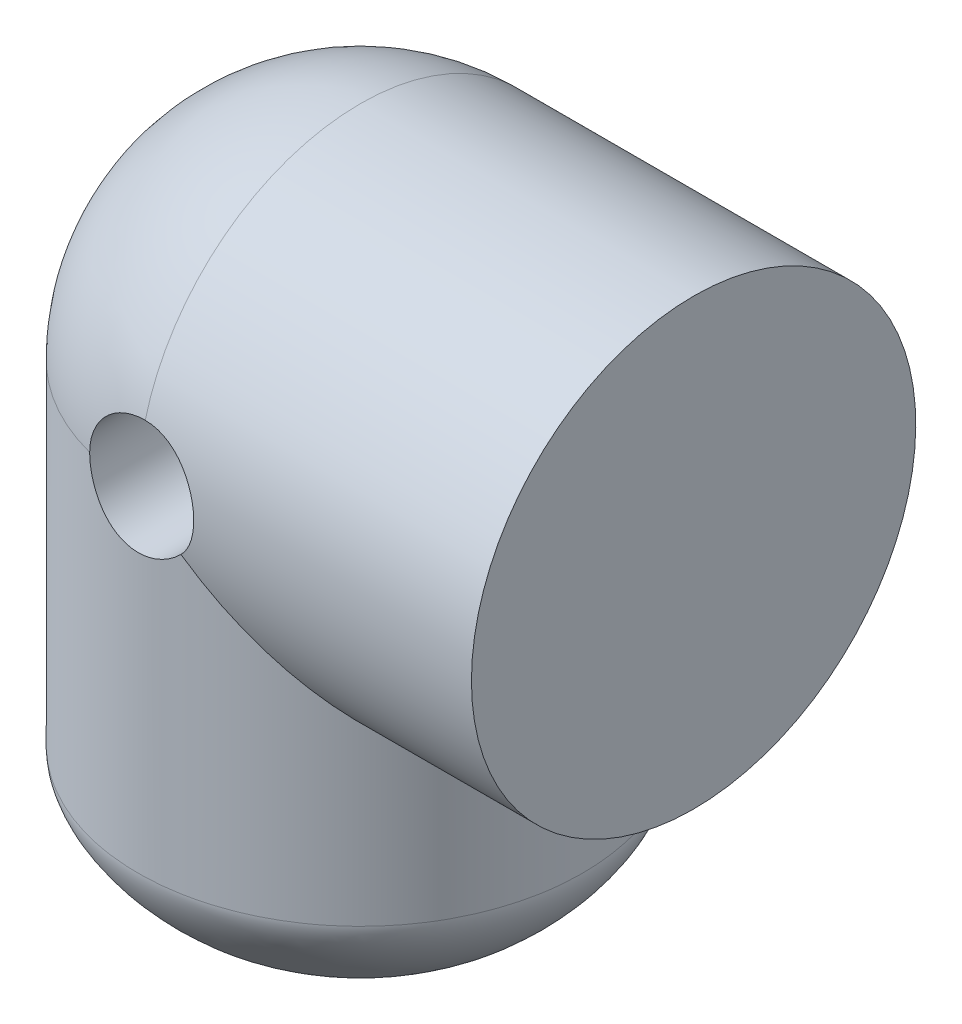
ISO-10303-21;
HEADER;
FILE_DESCRIPTION(('STEP AP214'),'2;1');
FILE_NAME('part.step','',(''),(''),'','','');
FILE_SCHEMA(('AUTOMOTIVE_DESIGN { 1 0 10303 214 1 1 1 1 }'));
ENDSEC;
DATA;
#1=APPLICATION_CONTEXT('core data for automotive mechanical design processes');
#2=APPLICATION_PROTOCOL_DEFINITION('international standard','automotive_design',2000,#1);
#3=PRODUCT_CONTEXT('',#1,'mechanical');
#4=PRODUCT('Part','Part','',(#3));
#5=PRODUCT_RELATED_PRODUCT_CATEGORY('part','',(#4));
#6=PRODUCT_DEFINITION_FORMATION('','',#4);
#7=PRODUCT_DEFINITION_CONTEXT('part definition',#1,'design');
#8=PRODUCT_DEFINITION('design','',#6,#7);
#9=PRODUCT_DEFINITION_SHAPE('','',#8);
#10=(LENGTH_UNIT() NAMED_UNIT(*) SI_UNIT(.MILLI.,.METRE.));
#11=(NAMED_UNIT(*) PLANE_ANGLE_UNIT() SI_UNIT($,.RADIAN.));
#12=(NAMED_UNIT(*) SI_UNIT($,.STERADIAN.) SOLID_ANGLE_UNIT());
#13=UNCERTAINTY_MEASURE_WITH_UNIT(LENGTH_MEASURE(1.E-05),#10,'distance_accuracy_value','');
#14=(GEOMETRIC_REPRESENTATION_CONTEXT(3) GLOBAL_UNCERTAINTY_ASSIGNED_CONTEXT((#13)) GLOBAL_UNIT_ASSIGNED_CONTEXT((#10,
#11,#12)) REPRESENTATION_CONTEXT('',''));
#15=CARTESIAN_POINT('',(0.,0.,0.));
#16=DIRECTION('',(0.,0.,1.));
#17=DIRECTION('',(1.,0.,0.));
#18=AXIS2_PLACEMENT_3D('',#15,#16,#17);
#19=CARTESIAN_POINT('',(0.,140.,0.));
#20=DIRECTION('',(0.,1.,0.));
#21=DIRECTION('',(0.,0.,1.));
#22=AXIS2_PLACEMENT_3D('',#19,#20,#21);
#23=CYLINDRICAL_SURFACE('',#22,20.);
#24=CARTESIAN_POINT('',(0.,150.,-20.));
#25=CARTESIAN_POINT('',(2.61799387362833,150.,-20.));
#26=CARTESIAN_POINT('',(5.23495769121637,150.,-19.4794535316967));
#27=CARTESIAN_POINT('',(10.0723796033872,150.,-17.4757277687548));
#28=CARTESIAN_POINT('',(12.2909344025836,150.,-15.9933368448783));
#29=CARTESIAN_POINT('',(15.9933368448783,150.,-12.2909344025836));
#30=CARTESIAN_POINT('',(17.4757277687555,150.,-10.0723796033854));
#31=CARTESIAN_POINT('',(19.479453531696,150.,-5.23495769121814));
#32=CARTESIAN_POINT('',(20.,150.,-2.61799387362817));
#33=CARTESIAN_POINT('',(20.,150.,2.61799387362817));
#34=CARTESIAN_POINT('',(19.4794535316963,150.,5.23495769121735));
#35=CARTESIAN_POINT('',(17.4757277687552,150.,10.0723796033863));
#36=CARTESIAN_POINT('',(15.9933368448782,150.,12.2909344025837));
#37=CARTESIAN_POINT('',(12.2909344025837,150.,15.9933368448782));
#38=CARTESIAN_POINT('',(10.0723796033861,150.,17.4757277687552));
#39=CARTESIAN_POINT('',(5.23495769121757,150.,19.4794535316962));
#40=CARTESIAN_POINT('',(2.61799387362817,150.,20.));
#41=CARTESIAN_POINT('',(-2.61799387362817,150.,20.));
#42=CARTESIAN_POINT('',(-5.23495769121655,150.,19.4794535316966));
#43=CARTESIAN_POINT('',(-10.072379603387,150.,17.4757277687549));
#44=CARTESIAN_POINT('',(-12.2909344025826,150.,15.9933368448793));
#45=CARTESIAN_POINT('',(-15.9933368448793,150.,12.2909344025826));
#46=CARTESIAN_POINT('',(-17.4757277687549,150.,10.072379603387));
#47=CARTESIAN_POINT('',(-19.4794535316966,150.,5.23495769121668));
#48=CARTESIAN_POINT('',(-20.,150.,2.61799387362814));
#49=CARTESIAN_POINT('',(-20.,150.,-2.61799387362821));
#50=CARTESIAN_POINT('',(-19.4794535316966,150.,-5.23495769121679));
#51=CARTESIAN_POINT('',(-17.475727768755,150.,-10.0723796033868));
#52=CARTESIAN_POINT('',(-15.9933368448774,150.,-12.2909344025845));
#53=CARTESIAN_POINT('',(-12.2909344025846,150.,-15.9933368448773));
#54=CARTESIAN_POINT('',(-10.0723796033859,150.,-17.4757277687553));
#55=CARTESIAN_POINT('',(-5.2349576912178,150.,-19.4794535316961));
#56=CARTESIAN_POINT('',(-2.61799387362834,150.,-20.));
#57=CARTESIAN_POINT('',(0.,150.,-20.));
#58=(BOUNDED_CURVE() B_SPLINE_CURVE(3,(#24,#25,#26,#27,#28,#29,#30,#31,#32,#33,#34,#35,#36,#37,
#38,#39,#40,#41,#42,#43,#44,#45,#46,#47,#48,#49,#50,#51,#52,#53,#54,#55,#56,#57),.UNSPECIFIED.,
.T.,.F.) B_SPLINE_CURVE_WITH_KNOTS((4,2,2,2,2,2,2,2,2,2,2,2,2,2,2,2,4),(0.,0.392699081698724,
0.785398163397448,1.17809724509617,1.5707963267949,1.96349540849362,2.35619449019234,
2.74889357189107,3.14159265358979,3.53429173528852,3.92699081698724,4.31968989868597,
4.71238898038469,5.10508806208341,5.49778714378214,5.89048622548086,6.28318530717959),
.UNSPECIFIED.) CURVE() GEOMETRIC_REPRESENTATION_ITEM() RATIONAL_B_SPLINE_CURVE((1.,1.,1.,1.,1.,
1.,1.,1.,1.,1.,1.,1.,1.,1.,1.,1.,1.,1.,1.,1.,1.,1.,1.,1.,1.,1.,1.,1.,1.,1.,1.,1.,1.,1.)) REPRESENTATION_ITEM(''));
#59=CARTESIAN_POINT('',(0.,150.,-20.));
#60=VERTEX_POINT('',#59);
#61=EDGE_CURVE('E12',#60,#60,#58,.F.);
#62=ORIENTED_EDGE('',*,*,#61,.T.);
#63=EDGE_LOOP('',(#62));
#64=FACE_BOUND('',#63,.T.);
#65=CARTESIAN_POINT('',(0.,180.,0.));
#66=DIRECTION('',(0.,1.,0.));
#67=DIRECTION('',(0.,0.,1.));
#68=AXIS2_PLACEMENT_3D('',#65,#66,#67);
#69=CIRCLE('',#68,20.);
#70=CARTESIAN_POINT('',(-5.,180.,19.3649167310371));
#71=VERTEX_POINT('',#70);
#72=CARTESIAN_POINT('',(-5.,180.,-19.3649167310371));
#73=VERTEX_POINT('',#72);
#74=EDGE_CURVE('E98',#71,#73,#69,.F.);
#75=ORIENTED_EDGE('',*,*,#74,.T.);
#76=CARTESIAN_POINT('',(-5.00000000000001,180.,-19.3649167310371));
#77=CARTESIAN_POINT('',(-5.00001753405856,179.861727049673,-19.3649007839448));
#78=CARTESIAN_POINT('',(-4.99426495949921,179.723459670746,-19.3663971752211));
#79=CARTESIAN_POINT('',(-4.97134855568943,179.447958841176,-19.3722985604214));
#80=CARTESIAN_POINT('',(-4.95418664661753,179.310725220483,-19.3767030649124));
#81=CARTESIAN_POINT('',(-4.90862550526642,179.038536617718,-19.3882932151163));
#82=CARTESIAN_POINT('',(-4.88024853995661,178.903577669662,-19.395473349332));
#83=CARTESIAN_POINT('',(-4.81249819309941,178.636613238401,-19.4123951927565));
#84=CARTESIAN_POINT('',(-4.77312466032893,178.504607795838,-19.4221369371922));
#85=CARTESIAN_POINT('',(-4.68370982441759,178.244502859836,-19.4438929800908));
#86=CARTESIAN_POINT('',(-4.63367187241133,178.116402153813,-19.4559065645286));
#87=CARTESIAN_POINT('',(-4.52328421223624,177.864872268759,-19.4818662950644));
#88=CARTESIAN_POINT('',(-4.46293067960909,177.741444843134,-19.4958131575534));
#89=CARTESIAN_POINT('',(-4.332373738047,177.500128925331,-19.5252403930813));
#90=CARTESIAN_POINT('',(-4.2621716081817,177.382239716536,-19.5407205669073));
#91=CARTESIAN_POINT('',(-4.11237230752994,177.152688078362,-19.5727939032118));
#92=CARTESIAN_POINT('',(-4.03277160234959,177.041028014883,-19.5893874833745));
#93=CARTESIAN_POINT('',(-3.86310059131533,176.822587927837,-19.6235594213257));
#94=CARTESIAN_POINT('',(-3.77285762537103,176.715943988735,-19.6411506158731));
#95=CARTESIAN_POINT('',(-3.58375217632144,176.510556751013,-19.6765336016142));
#96=CARTESIAN_POINT('',(-3.48488650634639,176.411816399562,-19.6943254648398));
#97=CARTESIAN_POINT('',(-3.27923259691242,176.222948182702,-19.7296100663421));
#98=CARTESIAN_POINT('',(-3.17244598079038,176.132818561205,-19.7471028650105));
#99=CARTESIAN_POINT('',(-2.95158589140582,175.961725498054,-19.781320245822));
#100=CARTESIAN_POINT('',(-2.83750974806655,175.880765445569,-19.7980445425702));
#101=CARTESIAN_POINT('',(-2.60125165700148,175.727579296085,-19.8304789838686));
#102=CARTESIAN_POINT('',(-2.4789805031238,175.655487101191,-19.846172223018));
#103=CARTESIAN_POINT('',(-2.22854048587879,175.521857621571,-19.8758524753698));
#104=CARTESIAN_POINT('',(-2.10036941582536,175.460324327441,-19.8898388429088));
#105=CARTESIAN_POINT('',(-1.83913888991782,175.348360515465,-19.9156918575849));
#106=CARTESIAN_POINT('',(-1.70608209372188,175.297924058366,-19.9275596379879));
#107=CARTESIAN_POINT('',(-1.43592780474629,175.208511078914,-19.9488465917985));
#108=CARTESIAN_POINT('',(-1.29882888101128,175.169538669874,-19.9582648861874));
#109=CARTESIAN_POINT('',(-1.02449944050247,175.104097434421,-19.9742050419042));
#110=CARTESIAN_POINT('',(-0.887329906187927,175.077387398506,-19.9807826130628));
#111=CARTESIAN_POINT('',(-0.611121470073011,175.035517805696,-19.9911405771331));
#112=CARTESIAN_POINT('',(-0.472081900132431,175.020362495072,-19.9949199417111));
#113=CARTESIAN_POINT('',(-0.0538316503970698,174.992511635345,-20.0018595987671));
#114=CARTESIAN_POINT('',(0.226850517941107,174.997350268909,-20.0006416404337));
#115=CARTESIAN_POINT('',(0.776805470835643,175.053141878785,-19.9867651529638));
#116=CARTESIAN_POINT('',(1.04619321655981,175.10306891912,-19.9743611583353));
#117=CARTESIAN_POINT('',(1.57268384713162,175.245947559976,-19.9398153073034));
#118=CARTESIAN_POINT('',(1.82978618788152,175.338901064114,-19.9176730200515));
#119=CARTESIAN_POINT('',(2.327032216563,175.565997608184,-19.8657515159188));
#120=CARTESIAN_POINT('',(2.56700133265154,175.700505871052,-19.835904985373));
#121=CARTESIAN_POINT('',(3.02140997555183,176.006746753968,-19.7717919823027));
#122=CARTESIAN_POINT('',(3.2358456486737,176.178484982024,-19.7375248442104));
#123=CARTESIAN_POINT('',(3.53678494662044,176.462913423814,-19.6850697901596));
#124=CARTESIAN_POINT('',(3.63481635600627,176.563739311129,-19.6671607784857));
#125=CARTESIAN_POINT('',(3.82205900545831,176.773302647234,-19.6316306769697));
#126=CARTESIAN_POINT('',(3.91127334319105,176.882037293996,-19.6140094878371));
#127=CARTESIAN_POINT('',(4.08032945790284,177.106782731146,-19.5795395310849));
#128=CARTESIAN_POINT('',(4.16016502733272,177.222798263494,-19.5626912794969));
#129=CARTESIAN_POINT('',(4.30981088668675,177.461234465956,-19.5302685472816));
#130=CARTESIAN_POINT('',(4.37962504585707,177.583652638981,-19.5146935760486));
#131=CARTESIAN_POINT('',(4.50912025416737,177.834840221823,-19.4851808747872));
#132=CARTESIAN_POINT('',(4.56874001933991,177.963642424255,-19.4712531918426));
#133=CARTESIAN_POINT('',(4.67685682835967,178.225985030435,-19.4455675792789));
#134=CARTESIAN_POINT('',(4.72535831123082,178.359523518524,-19.4338087840895));
#135=CARTESIAN_POINT('',(4.81082238230288,178.630284161891,-19.4128288796263));
#136=CARTESIAN_POINT('',(4.84779691847632,178.767502341726,-19.4036051438817));
#137=CARTESIAN_POINT('',(4.9099426208801,179.044686174372,-19.3879727962744));
#138=CARTESIAN_POINT('',(4.93511931688208,179.184650507916,-19.3815628656409));
#139=CARTESIAN_POINT('',(4.9695119617316,179.437257473509,-19.3727696898981));
#140=CARTESIAN_POINT('',(4.98094835236985,179.549583812837,-19.3698287297098));
#141=CARTESIAN_POINT('',(4.99618938185624,179.774603628844,-19.365900549509));
#142=CARTESIAN_POINT('',(5.00000636815257,179.88729621462,-19.3649101685657));
#143=CARTESIAN_POINT('',(5.,180.,-19.3649167310371));
#144=B_SPLINE_CURVE_WITH_KNOTS('',3,(#76,#77,#78,#79,#80,#81,#82,#83,#84,#85,#86,#87,#88,#89,
#90,#91,#92,#93,#94,#95,#96,#97,#98,#99,#100,#101,#102,#103,#104,#105,#106,#107,#108,#109,#110,
#111,#112,#113,#114,#115,#116,#117,#118,#119,#120,#121,#122,#123,#124,#125,#126,#127,#128,#129,
#130,#131,#132,#133,#134,#135,#136,#137,#138,#139,#140,#141,#142,#143),.UNSPECIFIED.,.F.,.F.,(4,
2,2,2,2,2,2,2,2,2,2,2,2,2,2,2,2,2,2,2,2,2,2,2,2,2,2,2,2,2,2,2,2,4),(0.,0.414682651698867,
0.829295530423262,1.24308931715176,1.65688879458831,2.07055843292849,2.4843817715531,
2.89815141525158,3.31207715822944,3.73400550955302,4.15609046783019,4.57808916078645,
5.00024332341809,5.42814441562207,5.85620687281819,6.28403966195083,6.71202577127494,
7.13118853175631,7.55050525711356,8.38810249417926,9.20710845531108,10.0261506551392,
10.8526066538661,11.6791872295638,12.104066664202,12.5287962930149,12.95380547348,
13.3786501148241,13.8059651975176,14.2331093744515,14.659809322141,15.0863090705413,
15.4248791296956,15.7629000801682),.UNSPECIFIED.);
#145=CARTESIAN_POINT('',(3.5355339059328,176.464466094067,-19.6850196850296));
#146=VERTEX_POINT('',#145);
#147=EDGE_CURVE('E69',#73,#146,#144,.T.);
#148=ORIENTED_EDGE('',*,*,#147,.T.);
#149=CARTESIAN_POINT('',(0.,180.,0.));
#150=DIRECTION('',(0.707106781186547,0.707106781186547,0.));
#151=DIRECTION('',(-0.707106781186547,0.707106781186547,0.));
#152=AXIS2_PLACEMENT_3D('',#149,#150,#151);
#153=ELLIPSE('',#152,28.2842712474619,20.);
#154=CARTESIAN_POINT('',(3.53553390593265,176.464466094067,19.6850196850296));
#155=VERTEX_POINT('',#154);
#156=EDGE_CURVE('E88',#155,#146,#153,.T.);
#157=ORIENTED_EDGE('',*,*,#156,.F.);
#158=CARTESIAN_POINT('',(5.,180.,19.3649167310371));
#159=CARTESIAN_POINT('',(5.00001753405855,179.861727049673,19.3649007839448));
#160=CARTESIAN_POINT('',(4.9942649594992,179.723459670746,19.3663971752211));
#161=CARTESIAN_POINT('',(4.97134855568943,179.447958841176,19.3722985604214));
#162=CARTESIAN_POINT('',(4.95418664661752,179.310725220483,19.3767030649124));
#163=CARTESIAN_POINT('',(4.90862550526641,179.038536617718,19.3882932151163));
#164=CARTESIAN_POINT('',(4.8802485399566,178.903577669662,19.395473349332));
#165=CARTESIAN_POINT('',(4.8124981930994,178.636613238401,19.4123951927565));
#166=CARTESIAN_POINT('',(4.77312466032892,178.504607795838,19.4221369371922));
#167=CARTESIAN_POINT('',(4.68370982441759,178.244502859836,19.4438929800908));
#168=CARTESIAN_POINT('',(4.63367187241132,178.116402153813,19.4559065645286));
#169=CARTESIAN_POINT('',(4.52328421223623,177.864872268759,19.4818662950644));
#170=CARTESIAN_POINT('',(4.46293067960908,177.741444843134,19.4958131575534));
#171=CARTESIAN_POINT('',(4.33237373804699,177.500128925331,19.5252403930813));
#172=CARTESIAN_POINT('',(4.26217160818169,177.382239716536,19.5407205669073));
#173=CARTESIAN_POINT('',(4.11237230752993,177.152688078362,19.5727939032118));
#174=CARTESIAN_POINT('',(4.03277160234958,177.041028014883,19.5893874833745));
#175=CARTESIAN_POINT('',(3.86310059131533,176.822587927837,19.6235594213257));
#176=CARTESIAN_POINT('',(3.77285762537102,176.715943988735,19.6411506158731));
#177=CARTESIAN_POINT('',(3.58375217632143,176.510556751013,19.6765336016142));
#178=CARTESIAN_POINT('',(3.48488650634639,176.411816399562,19.6943254648398));
#179=CARTESIAN_POINT('',(3.27923259691242,176.222948182702,19.7296100663421));
#180=CARTESIAN_POINT('',(3.17244598079037,176.132818561205,19.7471028650105));
#181=CARTESIAN_POINT('',(2.95158589140581,175.961725498054,19.781320245822));
#182=CARTESIAN_POINT('',(2.83750974806654,175.880765445569,19.7980445425702));
#183=CARTESIAN_POINT('',(2.60125165700147,175.727579296085,19.8304789838686));
#184=CARTESIAN_POINT('',(2.47898050312379,175.655487101191,19.846172223018));
#185=CARTESIAN_POINT('',(2.22854048587879,175.521857621571,19.8758524753698));
#186=CARTESIAN_POINT('',(2.10036941582536,175.460324327441,19.8898388429088));
#187=CARTESIAN_POINT('',(1.83913888991782,175.348360515465,19.9156918575849));
#188=CARTESIAN_POINT('',(1.70608209372187,175.297924058366,19.9275596379879));
#189=CARTESIAN_POINT('',(1.43592780474629,175.208511078914,19.9488465917985));
#190=CARTESIAN_POINT('',(1.29882888101127,175.169538669874,19.9582648861874));
#191=CARTESIAN_POINT('',(1.02449944050247,175.104097434421,19.9742050419042));
#192=CARTESIAN_POINT('',(0.88732990618792,175.077387398506,19.9807826130628));
#193=CARTESIAN_POINT('',(0.611121470073004,175.035517805696,19.9911405771331));
#194=CARTESIAN_POINT('',(0.472081900132424,175.020362495072,19.9949199417111));
#195=CARTESIAN_POINT('',(0.0538316503970628,174.992511635345,20.0018595987671));
#196=CARTESIAN_POINT('',(-0.226850517941114,174.997350268909,20.0006416404337));
#197=CARTESIAN_POINT('',(-0.77680547083565,175.053141878785,19.9867651529638));
#198=CARTESIAN_POINT('',(-1.04619321655981,175.10306891912,19.9743611583353));
#199=CARTESIAN_POINT('',(-1.57268384713163,175.245947559976,19.9398153073034));
#200=CARTESIAN_POINT('',(-1.82978618788153,175.338901064114,19.9176730200515));
#201=CARTESIAN_POINT('',(-2.327032216563,175.565997608184,19.8657515159188));
#202=CARTESIAN_POINT('',(-2.56700133265155,175.700505871052,19.835904985373));
#203=CARTESIAN_POINT('',(-3.02140997555183,176.006746753968,19.7717919823027));
#204=CARTESIAN_POINT('',(-3.23584564867371,176.178484982024,19.7375248442104));
#205=CARTESIAN_POINT('',(-3.53678494662045,176.462913423814,19.6850697901596));
#206=CARTESIAN_POINT('',(-3.63481635600627,176.563739311129,19.6671607784857));
#207=CARTESIAN_POINT('',(-3.82205900545831,176.773302647234,19.6316306769697));
#208=CARTESIAN_POINT('',(-3.91127334319106,176.882037293996,19.6140094878371));
#209=CARTESIAN_POINT('',(-4.08032945790284,177.106782731146,19.5795395310849));
#210=CARTESIAN_POINT('',(-4.16016502733273,177.222798263494,19.5626912794969));
#211=CARTESIAN_POINT('',(-4.30981088668676,177.461234465956,19.5302685472816));
#212=CARTESIAN_POINT('',(-4.37962504585708,177.583652638981,19.5146935760486));
#213=CARTESIAN_POINT('',(-4.50912025416738,177.834840221823,19.4851808747872));
#214=CARTESIAN_POINT('',(-4.56874001933992,177.963642424255,19.4712531918426));
#215=CARTESIAN_POINT('',(-4.67685682835968,178.225985030435,19.4455675792789));
#216=CARTESIAN_POINT('',(-4.72535831123082,178.359523518524,19.4338087840895));
#217=CARTESIAN_POINT('',(-4.81082238230289,178.630284161891,19.4128288796263));
#218=CARTESIAN_POINT('',(-4.84779691847633,178.767502341726,19.4036051438817));
#219=CARTESIAN_POINT('',(-4.90994262088011,179.044686174372,19.3879727962744));
#220=CARTESIAN_POINT('',(-4.93511931688209,179.184650507916,19.3815628656409));
#221=CARTESIAN_POINT('',(-4.96951196173161,179.437257473509,19.3727696898981));
#222=CARTESIAN_POINT('',(-4.98094835236985,179.549583812837,19.3698287297098));
#223=CARTESIAN_POINT('',(-4.99618938185625,179.774603628844,19.365900549509));
#224=CARTESIAN_POINT('',(-5.00000636815258,179.88729621462,19.3649101685657));
#225=CARTESIAN_POINT('',(-5.00000000000001,180.,19.3649167310371));
#226=B_SPLINE_CURVE_WITH_KNOTS('',3,(#158,#159,#160,#161,#162,#163,#164,#165,#166,#167,#168,
#169,#170,#171,#172,#173,#174,#175,#176,#177,#178,#179,#180,#181,#182,#183,#184,#185,#186,#187,
#188,#189,#190,#191,#192,#193,#194,#195,#196,#197,#198,#199,#200,#201,#202,#203,#204,#205,#206,
#207,#208,#209,#210,#211,#212,#213,#214,#215,#216,#217,#218,#219,#220,#221,#222,#223,#224,#225),
.UNSPECIFIED.,.F.,.F.,(4,2,2,2,2,2,2,2,2,2,2,2,2,2,2,2,2,2,2,2,2,2,2,2,2,2,2,2,2,2,2,2,2,4),(0.,
0.414682651698867,0.829295530423262,1.24308931715176,1.65688879458831,2.07055843292849,
2.4843817715531,2.89815141525158,3.31207715822944,3.73400550955302,4.15609046783019,
4.57808916078645,5.00024332341809,5.42814441562207,5.85620687281819,6.28403966195083,
6.71202577127494,7.13118853175631,7.55050525711356,8.38810249417926,9.20710845531108,
10.0261506551392,10.8526066538661,11.6791872295638,12.104066664202,12.5287962930149,
12.95380547348,13.3786501148241,13.8059651975176,14.2331093744515,14.659809322141,
15.0863090705413,15.4248791296956,15.7629000801682),.UNSPECIFIED.);
#227=EDGE_CURVE('E141',#155,#71,#226,.T.);
#228=ORIENTED_EDGE('',*,*,#227,.T.);
#229=EDGE_LOOP('',(#75,#148,#157,#228));
#230=FACE_BOUND('',#229,.T.);
#231=ADVANCED_FACE('F40',(#64,#230),#23,.T.);
#232=CARTESIAN_POINT('',(-20.,180.,0.));
#233=DIRECTION('',(1.,0.,0.));
#234=DIRECTION('',(0.,0.,-1.));
#235=AXIS2_PLACEMENT_3D('',#232,#233,#234);
#236=CYLINDRICAL_SURFACE('',#235,20.);
#237=CARTESIAN_POINT('',(30.,180.,0.));
#238=DIRECTION('',(-1.,0.,0.));
#239=DIRECTION('',(0.,0.,1.));
#240=AXIS2_PLACEMENT_3D('',#237,#238,#239);
#241=CIRCLE('',#240,20.);
#242=CARTESIAN_POINT('',(30.,180.,20.));
#243=VERTEX_POINT('',#242);
#244=EDGE_CURVE('E101',#243,#243,#241,.T.);
#245=ORIENTED_EDGE('',*,*,#244,.T.);
#246=EDGE_LOOP('',(#245));
#247=FACE_BOUND('',#246,.T.);
#248=CARTESIAN_POINT('',(0.,180.,0.));
#249=DIRECTION('',(1.,0.,0.));
#250=DIRECTION('',(0.,0.,-1.));
#251=AXIS2_PLACEMENT_3D('',#248,#249,#250);
#252=CIRCLE('',#251,20.);
#253=CARTESIAN_POINT('',(0.,185.,-19.3649167310371));
#254=VERTEX_POINT('',#253);
#255=CARTESIAN_POINT('',(0.,185.,19.3649167310371));
#256=VERTEX_POINT('',#255);
#257=EDGE_CURVE('E86',#254,#256,#252,.T.);
#258=ORIENTED_EDGE('',*,*,#257,.T.);
#259=CARTESIAN_POINT('',(0.,185.,19.3649167310371));
#260=CARTESIAN_POINT('',(0.138272834460867,185.000017533958,19.3649007840108));
#261=CARTESIAN_POINT('',(0.276540097364981,184.994264969098,19.3663971727449));
#262=CARTESIAN_POINT('',(0.552040698479359,184.971348603646,19.3722985480918));
#263=CARTESIAN_POINT('',(0.689274206732194,184.954186723143,19.3767030452941));
#264=CARTESIAN_POINT('',(0.961462818107446,184.908625619029,19.3882931863188));
#265=CARTESIAN_POINT('',(1.09642188384802,184.880248643511,19.3954733233156));
#266=CARTESIAN_POINT('',(1.36338654305592,184.812498258316,19.4123951766203));
#267=CARTESIAN_POINT('',(1.49539209593624,184.773124697624,19.4221369281064));
#268=CARTESIAN_POINT('',(1.75549952050959,184.683709006049,19.4438931792242));
#269=CARTESIAN_POINT('',(1.88360253729202,184.63367003977,19.4559070045749));
#270=CARTESIAN_POINT('',(2.13513670472043,184.52328004787,19.4818672653284));
#271=CARTESIAN_POINT('',(2.25856610756188,184.462925210023,19.4958144148289));
#272=CARTESIAN_POINT('',(2.49988287992364,184.332366896201,19.5252419107895));
#273=CARTESIAN_POINT('',(2.61777109804019,184.262164934853,19.5407220213511));
#274=CARTESIAN_POINT('',(2.84731830884538,184.112367755249,19.5727948522709));
#275=CARTESIAN_POINT('',(2.95897507240795,184.032769206952,19.5893879661596));
#276=CARTESIAN_POINT('',(3.17742098620076,183.863093664757,19.6235608159865));
#277=CARTESIAN_POINT('',(3.2840732679345,183.772843014785,19.6411534627799));
#278=CARTESIAN_POINT('',(3.48943878662241,183.583755006501,19.6765329589214));
#279=CARTESIAN_POINT('',(3.58815193813974,183.484917555805,19.694319810357));
#280=CARTESIAN_POINT('',(3.7770404379915,183.279248414074,19.7296076802507));
#281=CARTESIAN_POINT('',(3.86721120551103,183.172412488249,19.7471085412319));
#282=CARTESIAN_POINT('',(4.03831650717542,182.951526733052,19.7813289236806));
#283=CARTESIAN_POINT('',(4.11925425140885,182.837479432458,19.7980487155049));
#284=CARTESIAN_POINT('',(4.27248872706604,182.601146681445,19.8304933840741));
#285=CARTESIAN_POINT('',(4.34464017130082,182.478764432144,19.8461999180977));
#286=CARTESIAN_POINT('',(4.47831833397303,182.228188214362,19.8758921313774));
#287=CARTESIAN_POINT('',(4.53984905440515,182.099996458052,19.8898784582511));
#288=CARTESIAN_POINT('',(4.65178667733141,181.838763828965,19.9157262673607));
#289=CARTESIAN_POINT('',(4.70220315412227,181.705727245775,19.9275895767853));
#290=CARTESIAN_POINT('',(4.79155122383745,181.43570997438,19.9488617721828));
#291=CARTESIAN_POINT('',(4.83048565077104,181.298730268597,19.9582712637425));
#292=CARTESIAN_POINT('',(4.90874937626923,180.970641081124,19.977333643164));
#293=CARTESIAN_POINT('',(4.94292401780841,180.778207372243,19.9857953715887));
#294=CARTESIAN_POINT('',(4.98854765296026,180.390497232372,19.9971276024621));
#295=CARTESIAN_POINT('',(4.99999697791014,180.195220842871,19.9999981864303));
#296=CARTESIAN_POINT('',(5.00000213827048,179.861872086493,20.0000012831858));
#297=CARTESIAN_POINT('',(4.99427399752399,179.72377198089,19.9985663947955));
#298=CARTESIAN_POINT('',(4.97141332118513,179.448534680513,19.9928692349882));
#299=CARTESIAN_POINT('',(4.95427841295876,179.311397692068,19.9886063753472));
#300=CARTESIAN_POINT('',(4.90872988572256,179.039036512486,19.9773658100665));
#301=CARTESIAN_POINT('',(4.88030896286401,178.903813618877,19.9703863464094));
#302=CARTESIAN_POINT('',(4.81241221911679,178.636276608291,19.953902550352));
#303=CARTESIAN_POINT('',(4.77293227386864,178.50396359642,19.9443972760421));
#304=CARTESIAN_POINT('',(4.68331778193416,178.243447444321,19.9231417137924));
#305=CARTESIAN_POINT('',(4.63320214061523,178.115237470115,19.911395413059));
#306=CARTESIAN_POINT('',(4.52263895594003,177.863497328786,19.8859590993513));
#307=CARTESIAN_POINT('',(4.46218754300541,177.739968935623,19.8722683587302));
#308=CARTESIAN_POINT('',(4.33143672270069,177.498500609102,19.8433183513795));
#309=CARTESIAN_POINT('',(4.26114140397816,177.380558382621,19.8280597365604));
#310=CARTESIAN_POINT('',(4.11115040892326,177.150919897347,19.7963679590112));
#311=CARTESIAN_POINT('',(4.03145140224512,177.039225872144,19.7799343809809));
#312=CARTESIAN_POINT('',(3.86166498953841,176.820845795861,19.746022712636));
#313=CARTESIAN_POINT('',(3.77141396267035,176.714289043862,19.7285309991272));
#314=CARTESIAN_POINT('',(3.58234590171394,176.509117722294,19.6932622648125));
#315=CARTESIAN_POINT('',(3.48352876753021,176.410503245557,19.6754852406748));
#316=CARTESIAN_POINT('',(3.27794306946363,176.221831004686,19.6401287238781));
#317=CARTESIAN_POINT('',(3.17117188636969,176.131776081568,19.6225492984997));
#318=CARTESIAN_POINT('',(2.95043905083518,175.960893171865,19.5880885497288));
#319=CARTESIAN_POINT('',(2.83647990511339,175.88006199593,19.5712069863278));
#320=CARTESIAN_POINT('',(2.60025265095591,175.726968101864,19.538357799939));
#321=CARTESIAN_POINT('',(2.47788289218175,175.654858172096,19.5224084712044));
#322=CARTESIAN_POINT('',(2.22733806956989,175.521259705924,19.4921926968022));
#323=CARTESIAN_POINT('',(2.09916522525642,175.45976715126,19.4779256151211));
#324=CARTESIAN_POINT('',(1.83790859550981,175.347874623621,19.4515047718923));
#325=CARTESIAN_POINT('',(1.70482684477967,175.297470113748,19.4393501464194));
#326=CARTESIAN_POINT('',(1.43472323301395,175.208151270354,19.4175253674924));
#327=CARTESIAN_POINT('',(1.29770236028043,175.169234081869,19.4078545967996));
#328=CARTESIAN_POINT('',(0.969649311262445,175.091062268351,19.388258072338));
#329=CARTESIAN_POINT('',(0.777278442983472,175.056942632661,19.3795454346692));
#330=CARTESIAN_POINT('',(0.486786095386907,175.022795200311,19.3707911020722));
#331=CARTESIAN_POINT('',(0.389644148723505,175.014251396788,19.3685921002006));
#332=CARTESIAN_POINT('',(0.195011086099651,175.002854320618,19.3656540103179));
#333=CARTESIAN_POINT('',(0.0975199921468852,175.000000695415,19.364914831858));
#334=CARTESIAN_POINT('',(0.,175.,19.3649167310371));
#335=B_SPLINE_CURVE_WITH_KNOTS('',3,(#259,#260,#261,#262,#263,#264,#265,#266,#267,#268,#269,
#270,#271,#272,#273,#274,#275,#276,#277,#278,#279,#280,#281,#282,#283,#284,#285,#286,#287,#288,
#289,#290,#291,#292,#293,#294,#295,#296,#297,#298,#299,#300,#301,#302,#303,#304,#305,#306,#307,
#308,#309,#310,#311,#312,#313,#314,#315,#316,#317,#318,#319,#320,#321,#322,#323,#324,#325,#326,
#327,#328,#329,#330,#331,#332,#333,#334),.UNSPECIFIED.,.F.,.F.,(4,2,2,2,2,2,2,2,2,2,2,2,2,2,2,2,
2,2,2,2,2,2,2,2,2,2,2,2,2,2,2,2,2,2,2,2,2,4),(0.,0.414682304098708,0.829294838395685,
1.24308897507314,1.65688879459903,2.07056600330063,2.48439641808734,2.89816324957752,
3.31207715798314,3.73403959703021,4.15600657641179,4.5781985678156,5.00024332347431,
5.42852178064174,5.8566385042354,6.28438497552444,6.71202578153475,7.29745116747545,
7.88286801779763,8.29707792939238,8.71137402453764,9.12593867332563,9.54065813645485,
9.95464650316357,10.3687902024789,10.7827623953929,11.1968816404261,11.6185905521067,
12.0403043921403,12.4621577186184,12.8838647334355,13.3121294316923,13.7402316915537,
14.1681584575428,14.5959787804894,15.1810682853859,15.473544420134,15.7660024328792),.UNSPECIFIED.);
#336=EDGE_CURVE('E61',#256,#155,#335,.T.);
#337=ORIENTED_EDGE('',*,*,#336,.T.);
#338=ORIENTED_EDGE('',*,*,#156,.T.);
#339=CARTESIAN_POINT('',(0.,175.,-19.3649167310371));
#340=CARTESIAN_POINT('',(0.138272834460867,174.999982466042,-19.3649007840108));
#341=CARTESIAN_POINT('',(0.276540097364981,175.005735030902,-19.3663971727449));
#342=CARTESIAN_POINT('',(0.55204069847936,175.028651396354,-19.3722985480918));
#343=CARTESIAN_POINT('',(0.689274206732194,175.045813276857,-19.3767030452941));
#344=CARTESIAN_POINT('',(0.961462818107446,175.091374380971,-19.3882931863188));
#345=CARTESIAN_POINT('',(1.09642188384802,175.119751356489,-19.3954733233156));
#346=CARTESIAN_POINT('',(1.36338654305592,175.187501741684,-19.4123951766203));
#347=CARTESIAN_POINT('',(1.49539209593624,175.226875302376,-19.4221369281064));
#348=CARTESIAN_POINT('',(1.75549952050959,175.316290993951,-19.4438931792243));
#349=CARTESIAN_POINT('',(1.88360253729202,175.36632996023,-19.4559070045749));
#350=CARTESIAN_POINT('',(2.13513670472044,175.47671995213,-19.4818672653284));
#351=CARTESIAN_POINT('',(2.25856610756188,175.537074789977,-19.4958144148289));
#352=CARTESIAN_POINT('',(2.49988287992365,175.667633103799,-19.5252419107895));
#353=CARTESIAN_POINT('',(2.6177710980402,175.737835065148,-19.5407220213511));
#354=CARTESIAN_POINT('',(2.84731830884538,175.887632244751,-19.5727948522709));
#355=CARTESIAN_POINT('',(2.95897507240795,175.967230793048,-19.5893879661596));
#356=CARTESIAN_POINT('',(3.17742098620076,176.136906335243,-19.6235608159865));
#357=CARTESIAN_POINT('',(3.2840732679345,176.227156985215,-19.6411534627799));
#358=CARTESIAN_POINT('',(3.48943878662241,176.416244993499,-19.6765329589214));
#359=CARTESIAN_POINT('',(3.58815193813974,176.515082444195,-19.694319810357));
#360=CARTESIAN_POINT('',(3.7770404379915,176.720751585926,-19.7296076802507));
#361=CARTESIAN_POINT('',(3.86721120551103,176.827587511751,-19.7471085412319));
#362=CARTESIAN_POINT('',(4.03831650717542,177.048473266948,-19.7813289236806));
#363=CARTESIAN_POINT('',(4.11925425140885,177.162520567542,-19.7980487155049));
#364=CARTESIAN_POINT('',(4.27248872706604,177.398853318555,-19.8304933840741));
#365=CARTESIAN_POINT('',(4.34464017130082,177.521235567856,-19.8461999180977));
#366=CARTESIAN_POINT('',(4.47831833397303,177.771811785638,-19.8758921313774));
#367=CARTESIAN_POINT('',(4.53984905440515,177.900003541948,-19.8898784582511));
#368=CARTESIAN_POINT('',(4.65178667733141,178.161236171035,-19.9157262673607));
#369=CARTESIAN_POINT('',(4.70220315412227,178.294272754225,-19.9275895767853));
#370=CARTESIAN_POINT('',(4.79155122383745,178.56429002562,-19.9488617721828));
#371=CARTESIAN_POINT('',(4.83048565077104,178.701269731403,-19.9582712637425));
#372=CARTESIAN_POINT('',(4.90874937626923,179.029358918876,-19.977333643164));
#373=CARTESIAN_POINT('',(4.94292401780841,179.221792627757,-19.9857953715887));
#374=CARTESIAN_POINT('',(4.98854765296026,179.609502767628,-19.9971276024621));
#375=CARTESIAN_POINT('',(4.99999697791014,179.804779157129,-19.9999981864303));
#376=CARTESIAN_POINT('',(5.00000213827048,180.138127913507,-20.0000012831858));
#377=CARTESIAN_POINT('',(4.99427399752399,180.27622801911,-19.9985663947955));
#378=CARTESIAN_POINT('',(4.97141332118513,180.551465319487,-19.9928692349882));
#379=CARTESIAN_POINT('',(4.95427841295876,180.688602307932,-19.9886063753472));
#380=CARTESIAN_POINT('',(4.90872988572256,180.960963487515,-19.9773658100665));
#381=CARTESIAN_POINT('',(4.88030896286401,181.096186381123,-19.9703863464094));
#382=CARTESIAN_POINT('',(4.81241221911679,181.363723391709,-19.953902550352));
#383=CARTESIAN_POINT('',(4.77293227386864,181.49603640358,-19.9443972760421));
#384=CARTESIAN_POINT('',(4.68331778193416,181.756552555679,-19.9231417137924));
#385=CARTESIAN_POINT('',(4.63320214061523,181.884762529885,-19.911395413059));
#386=CARTESIAN_POINT('',(4.52263895594003,182.136502671214,-19.8859590993513));
#387=CARTESIAN_POINT('',(4.46218754300541,182.260031064377,-19.8722683587302));
#388=CARTESIAN_POINT('',(4.33143672270069,182.501499390898,-19.8433183513795));
#389=CARTESIAN_POINT('',(4.26114140397816,182.619441617379,-19.8280597365604));
#390=CARTESIAN_POINT('',(4.11115040892326,182.849080102653,-19.7963679590112));
#391=CARTESIAN_POINT('',(4.03145140224512,182.960774127856,-19.7799343809809));
#392=CARTESIAN_POINT('',(3.86166498953842,183.179154204139,-19.746022712636));
#393=CARTESIAN_POINT('',(3.77141396267037,183.285710956138,-19.7285309991272));
#394=CARTESIAN_POINT('',(3.58234590171396,183.490882277706,-19.6932622648125));
#395=CARTESIAN_POINT('',(3.48352876753024,183.589496754443,-19.6754852406748));
#396=CARTESIAN_POINT('',(3.27794306946366,183.778168995314,-19.6401287238781));
#397=CARTESIAN_POINT('',(3.17117188636971,183.868223918432,-19.6225492984997));
#398=CARTESIAN_POINT('',(2.95043905083519,184.039106828135,-19.5880885497288));
#399=CARTESIAN_POINT('',(2.83647990511339,184.11993800407,-19.5712069863278));
#400=CARTESIAN_POINT('',(2.60025265095591,184.273031898136,-19.538357799939));
#401=CARTESIAN_POINT('',(2.47788289218175,184.345141827904,-19.5224084712044));
#402=CARTESIAN_POINT('',(2.22733806956989,184.478740294076,-19.4921926968022));
#403=CARTESIAN_POINT('',(2.09916522525643,184.54023284874,-19.4779256151211));
#404=CARTESIAN_POINT('',(1.83790859550982,184.652125376379,-19.4515047718923));
#405=CARTESIAN_POINT('',(1.70482684477967,184.702529886252,-19.4393501464194));
#406=CARTESIAN_POINT('',(1.43472323301395,184.791848729646,-19.4175253674924));
#407=CARTESIAN_POINT('',(1.29770236028044,184.830765918131,-19.4078545967996));
#408=CARTESIAN_POINT('',(0.969649311262448,184.908937731649,-19.388258072338));
#409=CARTESIAN_POINT('',(0.777278442983473,184.943057367339,-19.3795454346692));
#410=CARTESIAN_POINT('',(0.486786095386905,184.977204799689,-19.3707911020722));
#411=CARTESIAN_POINT('',(0.389644148723501,184.985748603212,-19.3685921002006));
#412=CARTESIAN_POINT('',(0.195011086099648,184.997145679382,-19.3656540103179));
#413=CARTESIAN_POINT('',(0.0975199921468839,184.999999304585,-19.364914831858));
#414=CARTESIAN_POINT('',(0.,185.,-19.3649167310371));
#415=B_SPLINE_CURVE_WITH_KNOTS('',3,(#339,#340,#341,#342,#343,#344,#345,#346,#347,#348,#349,
#350,#351,#352,#353,#354,#355,#356,#357,#358,#359,#360,#361,#362,#363,#364,#365,#366,#367,#368,
#369,#370,#371,#372,#373,#374,#375,#376,#377,#378,#379,#380,#381,#382,#383,#384,#385,#386,#387,
#388,#389,#390,#391,#392,#393,#394,#395,#396,#397,#398,#399,#400,#401,#402,#403,#404,#405,#406,
#407,#408,#409,#410,#411,#412,#413,#414),.UNSPECIFIED.,.F.,.F.,(4,2,2,2,2,2,2,2,2,2,2,2,2,2,2,2,
2,2,2,2,2,2,2,2,2,2,2,2,2,2,2,2,2,2,2,2,2,4),(0.,0.414682304098708,0.829294838395685,
1.24308897507314,1.65688879459903,2.07056600330064,2.48439641808735,2.89816324957752,
3.31207715798314,3.73403959703021,4.15600657641179,4.5781985678156,5.00024332347431,
5.42852178064175,5.8566385042354,6.28438497552444,6.71202578153475,7.29745116747546,
7.88286801779763,8.29707792939238,8.71137402453764,9.12593867332563,9.54065813645485,
9.95464650316357,10.3687902024789,10.7827623953929,11.1968816404261,11.6185905521066,
12.0403043921403,12.4621577186183,12.8838647334355,13.3121294316923,13.7402316915536,
14.1681584575428,14.5959787804894,15.1810682853859,15.473544420134,15.7660024328792),.UNSPECIFIED.);
#416=EDGE_CURVE('E83',#146,#254,#415,.T.);
#417=ORIENTED_EDGE('',*,*,#416,.T.);
#418=EDGE_LOOP('',(#258,#337,#338,#417));
#419=FACE_BOUND('',#418,.T.);
#420=ADVANCED_FACE('F84',(#247,#419),#236,.T.);
#421=CARTESIAN_POINT('',(30.,180.,0.));
#422=DIRECTION('',(-1.,0.,0.));
#423=DIRECTION('',(0.,0.,1.));
#424=AXIS2_PLACEMENT_3D('',#421,#422,#423);
#425=PLANE('',#424);
#426=ORIENTED_EDGE('',*,*,#244,.F.);
#427=EDGE_LOOP('',(#426));
#428=FACE_BOUND('',#427,.T.);
#429=ADVANCED_FACE('F130',(#428),#425,.F.);
#430=CARTESIAN_POINT('',(0.,180.,0.));
#431=DIRECTION('',(-1.,0.,0.));
#432=DIRECTION('',(0.,0.,1.));
#433=AXIS2_PLACEMENT_3D('',#430,#431,#432);
#434=SPHERICAL_SURFACE('',#433,20.);
#435=CARTESIAN_POINT('',(0.,180.,19.3649167310371));
#436=DIRECTION('',(0.,0.,-1.));
#437=DIRECTION('',(-1.,0.,0.));
#438=AXIS2_PLACEMENT_3D('',#435,#436,#437);
#439=CIRCLE('',#438,5.);
#440=EDGE_CURVE('E95',#256,#71,#439,.F.);
#441=ORIENTED_EDGE('',*,*,#440,.F.);
#442=ORIENTED_EDGE('',*,*,#257,.F.);
#443=CARTESIAN_POINT('',(0.,180.,-19.3649167310371));
#444=DIRECTION('',(0.,0.,1.));
#445=DIRECTION('',(1.,0.,0.));
#446=AXIS2_PLACEMENT_3D('',#443,#444,#445);
#447=CIRCLE('',#446,5.);
#448=EDGE_CURVE('E90',#73,#254,#447,.F.);
#449=ORIENTED_EDGE('',*,*,#448,.F.);
#450=ORIENTED_EDGE('',*,*,#74,.F.);
#451=EDGE_LOOP('',(#441,#442,#449,#450));
#452=FACE_BOUND('',#451,.T.);
#453=ADVANCED_FACE('F97',(#452),#434,.T.);
#454=CARTESIAN_POINT('',(0.,140.,0.));
#455=DIRECTION('',(0.,-1.,0.));
#456=DIRECTION('',(0.,0.,-1.));
#457=AXIS2_PLACEMENT_3D('',#454,#455,#456);
#458=PLANE('',#457);
#459=CARTESIAN_POINT('',(0.,140.,-10.));
#460=CARTESIAN_POINT('',(-1.30899693681417,140.,-10.));
#461=CARTESIAN_POINT('',(-2.61747884560857,140.,-9.73972676584816));
#462=CARTESIAN_POINT('',(-5.03618980169327,140.,-8.73786388437759));
#463=CARTESIAN_POINT('',(-6.14546720129204,140.,-7.99666842243893));
#464=CARTESIAN_POINT('',(-7.99666842243898,140.,-6.145467201292));
#465=CARTESIAN_POINT('',(-8.7378638843776,140.,-5.03618980169352));
#466=CARTESIAN_POINT('',(-9.73972676584818,140.,-2.61747884560825));
#467=CARTESIAN_POINT('',(-10.,140.,-1.3089969368141));
#468=CARTESIAN_POINT('',(-10.,140.,1.30899693681407));
#469=CARTESIAN_POINT('',(-9.7397267658493,140.,2.61747884560828));
#470=CARTESIAN_POINT('',(-8.73786388437646,140.,5.03618980169355));
#471=CARTESIAN_POINT('',(-7.99666842243996,140.,6.14546720129158));
#472=CARTESIAN_POINT('',(-6.14546720129103,140.,7.99666842243938));
#473=CARTESIAN_POINT('',(-5.03618980169355,140.,8.73786388437755));
#474=CARTESIAN_POINT('',(-2.61747884560823,140.,9.73972676584822));
#475=CARTESIAN_POINT('',(-1.30899693681409,140.,10.));
#476=CARTESIAN_POINT('',(1.30899693681409,140.,10.));
#477=CARTESIAN_POINT('',(2.61747884560854,140.,9.73972676584707));
#478=CARTESIAN_POINT('',(5.03618980169329,140.,8.73786388437868));
#479=CARTESIAN_POINT('',(6.14546720129215,140.,7.99666842243939));
#480=CARTESIAN_POINT('',(7.99666842243881,140.,6.14546720129159));
#481=CARTESIAN_POINT('',(8.73786388437757,140.,5.03618980169341));
#482=CARTESIAN_POINT('',(9.73972676584818,140.,2.6174788456084));
#483=CARTESIAN_POINT('',(10.,140.,1.30899693681409));
#484=CARTESIAN_POINT('',(10.,140.,-1.30899693681409));
#485=CARTESIAN_POINT('',(9.73972676584819,140.,-2.61747884560868));
#486=CARTESIAN_POINT('',(8.73786388437757,140.,-5.03618980169312));
#487=CARTESIAN_POINT('',(7.99666842243917,140.,-6.14546720129123));
#488=CARTESIAN_POINT('',(6.1454672012918,140.,-7.99666842243974));
#489=CARTESIAN_POINT('',(5.03618980169369,140.,-8.73786388437757));
#490=CARTESIAN_POINT('',(2.61747884560811,140.,-9.73972676584819));
#491=CARTESIAN_POINT('',(1.30899693681416,140.,-10.));
#492=CARTESIAN_POINT('',(0.,140.,-10.));
#493=(BOUNDED_CURVE() B_SPLINE_CURVE(3,(#459,#460,#461,#462,#463,#464,#465,#466,#467,#468,#469,
#470,#471,#472,#473,#474,#475,#476,#477,#478,#479,#480,#481,#482,#483,#484,#485,#486,#487,#488,
#489,#490,#491,#492),.UNSPECIFIED.,.T.,.F.) B_SPLINE_CURVE_WITH_KNOTS((4,2,2,2,2,2,2,2,2,2,2,2,
2,2,2,2,4),(0.,0.392699081698725,0.785398163397448,1.17809724509617,1.5707963267949,
1.96349540849362,2.35619449019234,2.74889357189107,3.14159265358979,3.53429173528852,
3.92699081698724,4.31968989868597,4.71238898038469,5.10508806208341,5.49778714378214,
5.89048622548086,6.28318530717959),
.UNSPECIFIED.) CURVE() GEOMETRIC_REPRESENTATION_ITEM() RATIONAL_B_SPLINE_CURVE((1.,1.,1.,1.,1.,
1.,1.,1.,1.,1.,1.,1.,1.,1.,1.,1.,1.,1.,1.,1.,1.,1.,1.,1.,1.,1.,1.,1.,1.,1.,1.,1.,1.,1.)) REPRESENTATION_ITEM(''));
#494=CARTESIAN_POINT('',(0.,140.,-10.));
#495=VERTEX_POINT('',#494);
#496=EDGE_CURVE('E54',#495,#495,#493,.F.);
#497=ORIENTED_EDGE('',*,*,#496,.T.);
#498=EDGE_LOOP('',(#497));
#499=FACE_BOUND('',#498,.T.);
#500=ADVANCED_FACE('F115',(#499),#458,.T.);
#501=CARTESIAN_POINT('',(0.,180.,-20.));
#502=DIRECTION('',(0.,0.,1.));
#503=DIRECTION('',(1.,0.,0.));
#504=AXIS2_PLACEMENT_3D('',#501,#502,#503);
#505=CYLINDRICAL_SURFACE('',#504,5.);
#506=ORIENTED_EDGE('',*,*,#448,.T.);
#507=ORIENTED_EDGE('',*,*,#416,.F.);
#508=ORIENTED_EDGE('',*,*,#147,.F.);
#509=EDGE_LOOP('',(#506,#507,#508));
#510=FACE_BOUND('',#509,.T.);
#511=ORIENTED_EDGE('',*,*,#336,.F.);
#512=ORIENTED_EDGE('',*,*,#440,.T.);
#513=ORIENTED_EDGE('',*,*,#227,.F.);
#514=EDGE_LOOP('',(#511,#512,#513));
#515=FACE_BOUND('',#514,.T.);
#516=ADVANCED_FACE('F91',(#510,#515),#505,.F.);
#517=CARTESIAN_POINT('',(0.,140.,-10.));
#518=CARTESIAN_POINT('',(1.30899693681416,140.,-10.));
#519=CARTESIAN_POINT('',(2.61747884560811,140.,-9.73972676584819));
#520=CARTESIAN_POINT('',(5.03618980169369,140.,-8.73786388437757));
#521=CARTESIAN_POINT('',(6.1454672012918,140.,-7.99666842243974));
#522=CARTESIAN_POINT('',(7.99666842243917,140.,-6.14546720129123));
#523=CARTESIAN_POINT('',(8.73786388437757,140.,-5.03618980169312));
#524=CARTESIAN_POINT('',(9.73972676584819,140.,-2.61747884560868));
#525=CARTESIAN_POINT('',(10.,140.,-1.30899693681409));
#526=CARTESIAN_POINT('',(10.,140.,1.30899693681409));
#527=CARTESIAN_POINT('',(9.73972676584818,140.,2.6174788456084));
#528=CARTESIAN_POINT('',(8.73786388437757,140.,5.03618980169341));
#529=CARTESIAN_POINT('',(7.99666842243881,140.,6.14546720129159));
#530=CARTESIAN_POINT('',(6.14546720129215,140.,7.99666842243939));
#531=CARTESIAN_POINT('',(5.03618980169329,140.,8.73786388437868));
#532=CARTESIAN_POINT('',(2.61747884560854,140.,9.73972676584707));
#533=CARTESIAN_POINT('',(1.30899693681409,140.,10.));
#534=CARTESIAN_POINT('',(-1.30899693681409,140.,10.));
#535=CARTESIAN_POINT('',(-2.61747884560823,140.,9.73972676584822));
#536=CARTESIAN_POINT('',(-5.03618980169355,140.,8.73786388437755));
#537=CARTESIAN_POINT('',(-6.14546720129103,140.,7.99666842243938));
#538=CARTESIAN_POINT('',(-7.99666842243996,140.,6.14546720129158));
#539=CARTESIAN_POINT('',(-8.73786388437646,140.,5.03618980169355));
#540=CARTESIAN_POINT('',(-9.7397267658493,140.,2.61747884560828));
#541=CARTESIAN_POINT('',(-10.,140.,1.30899693681407));
#542=CARTESIAN_POINT('',(-10.,140.,-1.3089969368141));
#543=CARTESIAN_POINT('',(-9.73972676584818,140.,-2.61747884560825));
#544=CARTESIAN_POINT('',(-8.7378638843776,140.,-5.03618980169352));
#545=CARTESIAN_POINT('',(-7.99666842243898,140.,-6.145467201292));
#546=CARTESIAN_POINT('',(-6.14546720129204,140.,-7.99666842243893));
#547=CARTESIAN_POINT('',(-5.03618980169327,140.,-8.73786388437759));
#548=CARTESIAN_POINT('',(-2.61747884560857,140.,-9.73972676584816));
#549=CARTESIAN_POINT('',(-1.30899693681417,140.,-10.));
#550=CARTESIAN_POINT('',(0.,140.,-10.));
#551=CARTESIAN_POINT('',(0.,140.,-20.));
#552=CARTESIAN_POINT('',(2.61799387362833,140.,-19.9999999999955));
#553=CARTESIAN_POINT('',(5.23495769121679,140.,-19.4794535316986));
#554=CARTESIAN_POINT('',(10.0723796033868,140.,-17.4757277687529));
#555=CARTESIAN_POINT('',(12.2909344025847,140.,-15.9933368448795));
#556=CARTESIAN_POINT('',(15.9933368448772,140.,-12.2909344025825));
#557=CARTESIAN_POINT('',(17.4757277687574,140.,-10.0723796033862));
#558=CARTESIAN_POINT('',(19.4794535316941,140.,-5.23495769121735));
#559=CARTESIAN_POINT('',(20.,140.,-2.61799387362817));
#560=CARTESIAN_POINT('',(20.,140.,2.61799387362817));
#561=CARTESIAN_POINT('',(19.4794535316964,140.,5.23495769121736));
#562=CARTESIAN_POINT('',(17.4757277687551,140.,10.0723796033863));
#563=CARTESIAN_POINT('',(15.9933368448753,140.,12.290934402582));
#564=CARTESIAN_POINT('',(12.2909344025866,140.,15.9933368448799));
#565=CARTESIAN_POINT('',(10.072379603386,140.,17.4757277687551));
#566=CARTESIAN_POINT('',(5.23495769121764,140.,19.4794535316964));
#567=CARTESIAN_POINT('',(2.61799387362817,140.,20.));
#568=CARTESIAN_POINT('',(-2.61799387362817,140.,20.));
#569=CARTESIAN_POINT('',(-5.23495769121646,140.,19.4794535316964));
#570=CARTESIAN_POINT('',(-10.0723796033871,140.,17.4757277687551));
#571=CARTESIAN_POINT('',(-12.2909344025798,140.,15.9933368448776));
#572=CARTESIAN_POINT('',(-15.9933368448822,140.,12.2909344025843));
#573=CARTESIAN_POINT('',(-17.4757277687552,140.,10.0723796033865));
#574=CARTESIAN_POINT('',(-19.4794535316963,140.,5.23495769121712));
#575=CARTESIAN_POINT('',(-20.0000000000023,140.,2.61799387362814));
#576=CARTESIAN_POINT('',(-19.9999999999977,140.,-2.61799387362821));
#577=CARTESIAN_POINT('',(-19.4794535316986,140.,-5.23495769121763));
#578=CARTESIAN_POINT('',(-17.4757277687529,140.,-10.0723796033859));
#579=CARTESIAN_POINT('',(-15.9933368448779,140.,-12.2909344025851));
#580=CARTESIAN_POINT('',(-12.2909344025841,140.,-15.9933368448767));
#581=CARTESIAN_POINT('',(-10.0723796033877,140.,-17.4757277687597));
#582=CARTESIAN_POINT('',(-5.23495769121599,140.,-19.4794535316918));
#583=CARTESIAN_POINT('',(-2.61799387362834,140.,-20.0000000000046));
#584=CARTESIAN_POINT('',(0.,140.,-20.));
#585=CARTESIAN_POINT('',(0.,150.,-20.));
#586=CARTESIAN_POINT('',(2.61799387362833,150.,-20.));
#587=CARTESIAN_POINT('',(5.23495769121637,150.,-19.4794535316967));
#588=CARTESIAN_POINT('',(10.0723796033872,150.,-17.4757277687548));
#589=CARTESIAN_POINT('',(12.2909344025836,150.,-15.9933368448783));
#590=CARTESIAN_POINT('',(15.9933368448783,150.,-12.2909344025836));
#591=CARTESIAN_POINT('',(17.4757277687555,150.,-10.0723796033854));
#592=CARTESIAN_POINT('',(19.479453531696,150.,-5.23495769121814));
#593=CARTESIAN_POINT('',(20.,150.,-2.61799387362817));
#594=CARTESIAN_POINT('',(20.,150.,2.61799387362817));
#595=CARTESIAN_POINT('',(19.4794535316963,150.,5.23495769121735));
#596=CARTESIAN_POINT('',(17.4757277687552,150.,10.0723796033863));
#597=CARTESIAN_POINT('',(15.9933368448782,150.,12.2909344025837));
#598=CARTESIAN_POINT('',(12.2909344025837,150.,15.9933368448782));
#599=CARTESIAN_POINT('',(10.0723796033861,150.,17.4757277687552));
#600=CARTESIAN_POINT('',(5.23495769121757,150.,19.4794535316962));
#601=CARTESIAN_POINT('',(2.61799387362817,150.,20.));
#602=CARTESIAN_POINT('',(-2.61799387362817,150.,20.));
#603=CARTESIAN_POINT('',(-5.23495769121655,150.,19.4794535316966));
#604=CARTESIAN_POINT('',(-10.072379603387,150.,17.4757277687549));
#605=CARTESIAN_POINT('',(-12.2909344025826,150.,15.9933368448793));
#606=CARTESIAN_POINT('',(-15.9933368448793,150.,12.2909344025826));
#607=CARTESIAN_POINT('',(-17.4757277687549,150.,10.072379603387));
#608=CARTESIAN_POINT('',(-19.4794535316966,150.,5.23495769121668));
#609=CARTESIAN_POINT('',(-20.,150.,2.61799387362814));
#610=CARTESIAN_POINT('',(-20.,150.,-2.61799387362821));
#611=CARTESIAN_POINT('',(-19.4794535316966,150.,-5.23495769121679));
#612=CARTESIAN_POINT('',(-17.475727768755,150.,-10.0723796033868));
#613=CARTESIAN_POINT('',(-15.9933368448774,150.,-12.2909344025845));
#614=CARTESIAN_POINT('',(-12.2909344025846,150.,-15.9933368448773));
#615=CARTESIAN_POINT('',(-10.0723796033859,150.,-17.4757277687553));
#616=CARTESIAN_POINT('',(-5.2349576912178,150.,-19.4794535316961));
#617=CARTESIAN_POINT('',(-2.61799387362834,150.,-20.));
#618=CARTESIAN_POINT('',(0.,150.,-20.));
#619=(BOUNDED_SURFACE() B_SPLINE_SURFACE(2,3,((#517,#518,#519,#520,#521,#522,#523,#524,#525,
#526,#527,#528,#529,#530,#531,#532,#533,#534,#535,#536,#537,#538,#539,#540,#541,#542,#543,#544,
#545,#546,#547,#548,#549,#550),(#551,#552,#553,#554,#555,#556,#557,#558,#559,#560,#561,#562,
#563,#564,#565,#566,#567,#568,#569,#570,#571,#572,#573,#574,#575,#576,#577,#578,#579,#580,#581,
#582,#583,#584),(#585,#586,#587,#588,#589,#590,#591,#592,#593,#594,#595,#596,#597,#598,#599,
#600,#601,#602,#603,#604,#605,#606,#607,#608,#609,#610,#611,#612,#613,#614,#615,#616,#617,
#618)),.UNSPECIFIED.,.F.,.T.,.F.) B_SPLINE_SURFACE_WITH_KNOTS((3,3),(4,2,2,2,2,2,2,2,2,2,2,2,2,
2,2,2,4),(0.,1.),(0.,0.392699081698724,0.785398163397448,1.17809724509617,1.5707963267949,
1.96349540849362,2.35619449019234,2.74889357189107,3.14159265358979,3.53429173528852,
3.92699081698724,4.31968989868597,4.71238898038469,5.10508806208341,5.49778714378214,
5.89048622548086,6.28318530717959),
.UNSPECIFIED.) GEOMETRIC_REPRESENTATION_ITEM() RATIONAL_B_SPLINE_SURFACE(((1.,1.,1.,1.,1.,1.,1.,
1.,1.,1.,1.,1.,1.,1.,1.,1.,1.,1.,1.,1.,1.,1.,1.,1.,1.,1.,1.,1.,1.,1.,1.,1.,1.,1.),
(0.353553390593274,0.353553390593274,0.353553390593274,0.353553390593274,0.353553390593274,
0.353553390593274,0.353553390593274,0.353553390593274,0.353553390593274,0.353553390593274,
0.353553390593274,0.353553390593274,0.353553390593274,0.353553390593274,0.353553390593274,
0.353553390593274,0.353553390593274,0.353553390593274,0.353553390593274,0.353553390593274,
0.353553390593274,0.353553390593274,0.353553390593274,0.353553390593274,0.353553390593274,
0.353553390593274,0.353553390593274,0.353553390593274,0.353553390593274,0.353553390593274,
0.353553390593274,0.353553390593274,0.353553390593274,0.353553390593274),(1.,1.,1.,1.,1.,1.,1.,
1.,1.,1.,1.,1.,1.,1.,1.,1.,1.,1.,1.,1.,1.,1.,1.,1.,1.,1.,1.,1.,1.,1.,1.,1.,1.,1.))) REPRESENTATION_ITEM('') SURFACE());
#620=ORIENTED_EDGE('',*,*,#61,.F.);
#621=EDGE_LOOP('',(#620));
#622=FACE_BOUND('',#621,.T.);
#623=ORIENTED_EDGE('',*,*,#496,.F.);
#624=EDGE_LOOP('',(#623));
#625=FACE_BOUND('',#624,.T.);
#626=ADVANCED_FACE('F43',(#622,#625),#619,.T.);
#627=CLOSED_SHELL('',(#231,#420,#429,#453,#500,#516,#626));
#628=MANIFOLD_SOLID_BREP('B2',#627);
#629=ADVANCED_BREP_SHAPE_REPRESENTATION('',(#18,#628),#14);
#630=SHAPE_DEFINITION_REPRESENTATION(#9,#629);
ENDSEC;
END-ISO-10303-21;
